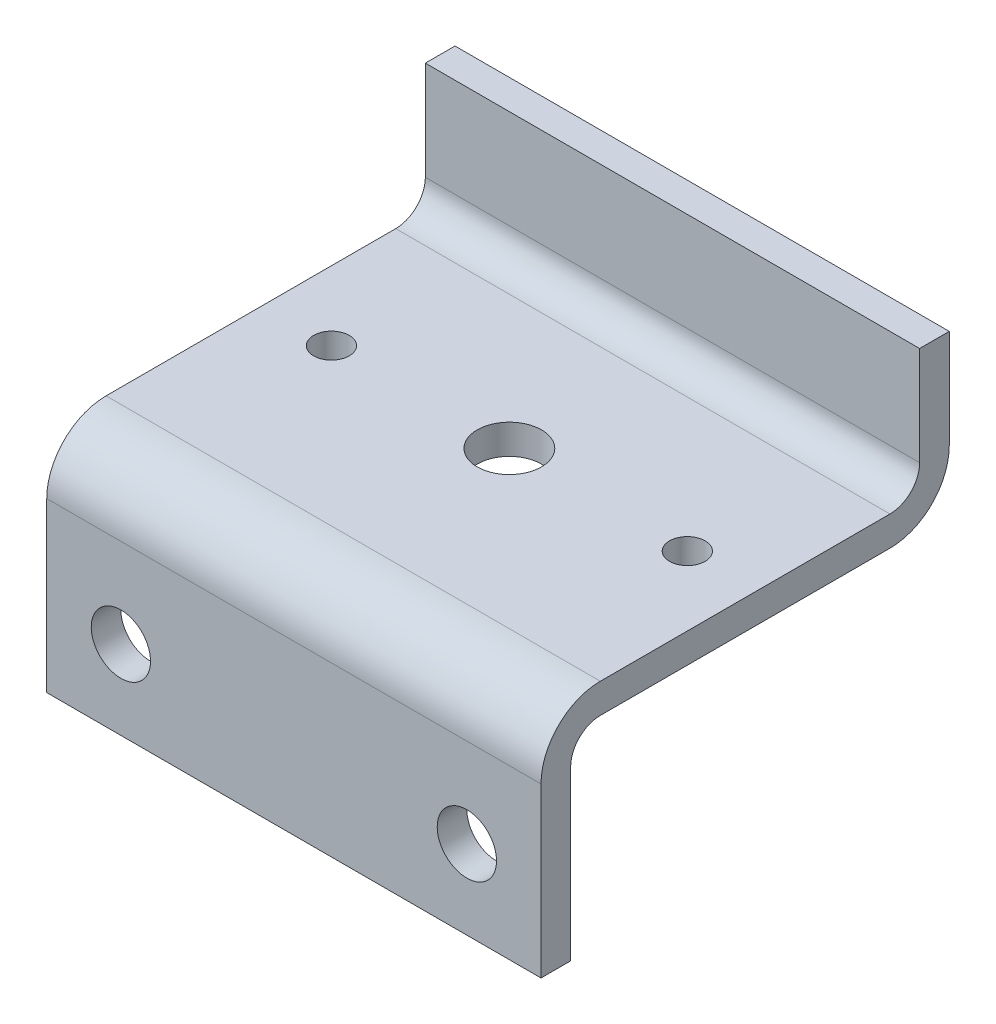
ISO-10303-21;
HEADER;
FILE_DESCRIPTION(('STEP AP214'),'2;1');
FILE_NAME('part.step','',(''),(''),'','','');
FILE_SCHEMA(('AUTOMOTIVE_DESIGN { 1 0 10303 214 1 1 1 1 }'));
ENDSEC;
DATA;
#1=APPLICATION_CONTEXT('core data for automotive mechanical design processes');
#2=APPLICATION_PROTOCOL_DEFINITION('international standard','automotive_design',2000,#1);
#3=PRODUCT_CONTEXT('',#1,'mechanical');
#4=PRODUCT('Part','Part','',(#3));
#5=PRODUCT_RELATED_PRODUCT_CATEGORY('part','',(#4));
#6=PRODUCT_DEFINITION_FORMATION('','',#4);
#7=PRODUCT_DEFINITION_CONTEXT('part definition',#1,'design');
#8=PRODUCT_DEFINITION('design','',#6,#7);
#9=PRODUCT_DEFINITION_SHAPE('','',#8);
#10=(LENGTH_UNIT() NAMED_UNIT(*) SI_UNIT(.MILLI.,.METRE.));
#11=(NAMED_UNIT(*) PLANE_ANGLE_UNIT() SI_UNIT($,.RADIAN.));
#12=(NAMED_UNIT(*) SI_UNIT($,.STERADIAN.) SOLID_ANGLE_UNIT());
#13=UNCERTAINTY_MEASURE_WITH_UNIT(LENGTH_MEASURE(1.E-05),#10,'distance_accuracy_value','');
#14=(GEOMETRIC_REPRESENTATION_CONTEXT(3) GLOBAL_UNCERTAINTY_ASSIGNED_CONTEXT((#13)) GLOBAL_UNIT_ASSIGNED_CONTEXT((#10,
#11,#12)) REPRESENTATION_CONTEXT('',''));
#15=CARTESIAN_POINT('',(0.,0.,0.));
#16=DIRECTION('',(0.,0.,1.));
#17=DIRECTION('',(1.,0.,0.));
#18=AXIS2_PLACEMENT_3D('',#15,#16,#17);
#19=CARTESIAN_POINT('',(25.,0.,-3.));
#20=DIRECTION('',(0.,1.,0.));
#21=DIRECTION('',(0.,0.,1.));
#22=AXIS2_PLACEMENT_3D('',#19,#20,#21);
#23=PLANE('',#22);
#24=DIRECTION('',(0.,0.,-1.));
#25=VECTOR('',#24,1.);
#26=CARTESIAN_POINT('',(-25.,0.,-3.));
#27=LINE('',#26,#25);
#28=CARTESIAN_POINT('',(-25.,0.,0.));
#29=VERTEX_POINT('',#28);
#30=CARTESIAN_POINT('',(-25.,0.,-3.));
#31=VERTEX_POINT('',#30);
#32=EDGE_CURVE('E159',#29,#31,#27,.T.);
#33=ORIENTED_EDGE('',*,*,#32,.T.);
#34=DIRECTION('',(-1.,0.,0.));
#35=VECTOR('',#34,1.);
#36=CARTESIAN_POINT('',(25.,0.,-3.));
#37=LINE('',#36,#35);
#38=CARTESIAN_POINT('',(25.,0.,-3.));
#39=VERTEX_POINT('',#38);
#40=EDGE_CURVE('E11',#39,#31,#37,.T.);
#41=ORIENTED_EDGE('',*,*,#40,.F.);
#42=DIRECTION('',(0.,0.,-1.));
#43=VECTOR('',#42,1.);
#44=CARTESIAN_POINT('',(25.,0.,-3.));
#45=LINE('',#44,#43);
#46=CARTESIAN_POINT('',(25.,0.,0.));
#47=VERTEX_POINT('',#46);
#48=EDGE_CURVE('E182',#47,#39,#45,.T.);
#49=ORIENTED_EDGE('',*,*,#48,.F.);
#50=DIRECTION('',(-1.,0.,0.));
#51=VECTOR('',#50,1.);
#52=CARTESIAN_POINT('',(25.,0.,0.));
#53=LINE('',#52,#51);
#54=EDGE_CURVE('E155',#47,#29,#53,.T.);
#55=ORIENTED_EDGE('',*,*,#54,.T.);
#56=EDGE_LOOP('',(#33,#41,#49,#55));
#57=FACE_BOUND('',#56,.T.);
#58=ADVANCED_FACE('F39',(#57),#23,.F.);
#59=CARTESIAN_POINT('',(25.,17.,-3.));
#60=DIRECTION('',(0.,0.,1.));
#61=DIRECTION('',(0.,-1.,0.));
#62=AXIS2_PLACEMENT_3D('',#59,#60,#61);
#63=PLANE('',#62);
#64=CARTESIAN_POINT('',(-17.5,7.99999999999998,-3.));
#65=DIRECTION('',(0.,0.,-1.));
#66=DIRECTION('',(0.,1.,0.));
#67=AXIS2_PLACEMENT_3D('',#64,#65,#66);
#68=CIRCLE('',#67,3.);
#69=CARTESIAN_POINT('',(-17.5,11.,-3.));
#70=VERTEX_POINT('',#69);
#71=EDGE_CURVE('E329',#70,#70,#68,.T.);
#72=ORIENTED_EDGE('',*,*,#71,.F.);
#73=EDGE_LOOP('',(#72));
#74=FACE_BOUND('',#73,.T.);
#75=CARTESIAN_POINT('',(17.5,7.99999999999998,-3.));
#76=DIRECTION('',(0.,0.,-1.));
#77=DIRECTION('',(0.,1.,0.));
#78=AXIS2_PLACEMENT_3D('',#75,#76,#77);
#79=CIRCLE('',#78,3.);
#80=CARTESIAN_POINT('',(17.5,11.,-3.));
#81=VERTEX_POINT('',#80);
#82=EDGE_CURVE('E326',#81,#81,#79,.T.);
#83=ORIENTED_EDGE('',*,*,#82,.F.);
#84=EDGE_LOOP('',(#83));
#85=FACE_BOUND('',#84,.T.);
#86=DIRECTION('',(0.,1.,0.));
#87=VECTOR('',#86,1.);
#88=CARTESIAN_POINT('',(-25.,17.,-3.));
#89=LINE('',#88,#87);
#90=CARTESIAN_POINT('',(-25.,17.,-3.));
#91=VERTEX_POINT('',#90);
#92=EDGE_CURVE('E162',#31,#91,#89,.T.);
#93=ORIENTED_EDGE('',*,*,#92,.T.);
#94=DIRECTION('',(-1.,0.,0.));
#95=VECTOR('',#94,1.);
#96=CARTESIAN_POINT('',(25.,17.,-3.));
#97=LINE('',#96,#95);
#98=CARTESIAN_POINT('',(25.,17.,-3.));
#99=VERTEX_POINT('',#98);
#100=EDGE_CURVE('E47',#99,#91,#97,.T.);
#101=ORIENTED_EDGE('',*,*,#100,.F.);
#102=DIRECTION('',(0.,1.,0.));
#103=VECTOR('',#102,1.);
#104=CARTESIAN_POINT('',(25.,17.,-3.));
#105=LINE('',#104,#103);
#106=EDGE_CURVE('E110',#39,#99,#105,.T.);
#107=ORIENTED_EDGE('',*,*,#106,.F.);
#108=ORIENTED_EDGE('',*,*,#40,.T.);
#109=EDGE_LOOP('',(#93,#101,#107,#108));
#110=FACE_BOUND('',#109,.T.);
#111=ADVANCED_FACE('F265',(#74,#85,#110),#63,.F.);
#112=CARTESIAN_POINT('',(25.,17.,-6.));
#113=DIRECTION('',(-1.,0.,0.));
#114=DIRECTION('',(0.,0.,1.));
#115=AXIS2_PLACEMENT_3D('',#112,#113,#114);
#116=CYLINDRICAL_SURFACE('',#115,3.);
#117=CARTESIAN_POINT('',(-25.,17.,-6.));
#118=DIRECTION('',(-1.,0.,0.));
#119=DIRECTION('',(0.,0.,-1.));
#120=AXIS2_PLACEMENT_3D('',#117,#118,#119);
#121=CIRCLE('',#120,3.);
#122=CARTESIAN_POINT('',(-25.,20.,-6.));
#123=VERTEX_POINT('',#122);
#124=EDGE_CURVE('E165',#91,#123,#121,.T.);
#125=ORIENTED_EDGE('',*,*,#124,.T.);
#126=DIRECTION('',(-1.,0.,0.));
#127=VECTOR('',#126,1.);
#128=CARTESIAN_POINT('',(25.,20.,-6.));
#129=LINE('',#128,#127);
#130=CARTESIAN_POINT('',(25.,20.,-6.));
#131=VERTEX_POINT('',#130);
#132=EDGE_CURVE('E201',#131,#123,#129,.T.);
#133=ORIENTED_EDGE('',*,*,#132,.F.);
#134=CARTESIAN_POINT('',(25.,17.,-6.));
#135=DIRECTION('',(-1.,0.,0.));
#136=DIRECTION('',(0.,0.,-1.));
#137=AXIS2_PLACEMENT_3D('',#134,#135,#136);
#138=CIRCLE('',#137,3.);
#139=EDGE_CURVE('E209',#99,#131,#138,.T.);
#140=ORIENTED_EDGE('',*,*,#139,.F.);
#141=ORIENTED_EDGE('',*,*,#100,.T.);
#142=EDGE_LOOP('',(#125,#133,#140,#141));
#143=FACE_BOUND('',#142,.T.);
#144=ADVANCED_FACE('F207',(#143),#116,.F.);
#145=CARTESIAN_POINT('',(25.,20.,-6.));
#146=DIRECTION('',(0.,1.,0.));
#147=DIRECTION('',(0.,0.,1.));
#148=AXIS2_PLACEMENT_3D('',#145,#146,#147);
#149=PLANE('',#148);
#150=CARTESIAN_POINT('',(18.,20.,-21.8));
#151=DIRECTION('',(0.,1.,0.));
#152=DIRECTION('',(0.,0.,1.));
#153=AXIS2_PLACEMENT_3D('',#150,#151,#152);
#154=CIRCLE('',#153,1.8);
#155=CARTESIAN_POINT('',(18.,20.,-20.));
#156=VERTEX_POINT('',#155);
#157=EDGE_CURVE('E320',#156,#156,#154,.F.);
#158=ORIENTED_EDGE('',*,*,#157,.F.);
#159=EDGE_LOOP('',(#158));
#160=FACE_BOUND('',#159,.T.);
#161=CARTESIAN_POINT('',(-18.,20.,-21.8));
#162=DIRECTION('',(0.,1.,0.));
#163=DIRECTION('',(0.,0.,1.));
#164=AXIS2_PLACEMENT_3D('',#161,#162,#163);
#165=CIRCLE('',#164,1.8);
#166=CARTESIAN_POINT('',(-18.,20.,-20.));
#167=VERTEX_POINT('',#166);
#168=EDGE_CURVE('E314',#167,#167,#165,.F.);
#169=ORIENTED_EDGE('',*,*,#168,.F.);
#170=EDGE_LOOP('',(#169));
#171=FACE_BOUND('',#170,.T.);
#172=CARTESIAN_POINT('',(0.,20.,-21.8));
#173=DIRECTION('',(0.,1.,0.));
#174=DIRECTION('',(0.,0.,1.));
#175=AXIS2_PLACEMENT_3D('',#172,#173,#174);
#176=CIRCLE('',#175,3.25);
#177=CARTESIAN_POINT('',(0.,20.,-18.55));
#178=VERTEX_POINT('',#177);
#179=EDGE_CURVE('E163',#178,#178,#176,.F.);
#180=ORIENTED_EDGE('',*,*,#179,.F.);
#181=EDGE_LOOP('',(#180));
#182=FACE_BOUND('',#181,.T.);
#183=DIRECTION('',(0.,0.,-1.));
#184=VECTOR('',#183,1.);
#185=CARTESIAN_POINT('',(-25.,20.,-6.));
#186=LINE('',#185,#184);
#187=CARTESIAN_POINT('',(-25.,20.,-35.3));
#188=VERTEX_POINT('',#187);
#189=EDGE_CURVE('E167',#123,#188,#186,.T.);
#190=ORIENTED_EDGE('',*,*,#189,.T.);
#191=DIRECTION('',(-1.,0.,0.));
#192=VECTOR('',#191,1.);
#193=CARTESIAN_POINT('',(25.,20.,-35.3));
#194=LINE('',#193,#192);
#195=CARTESIAN_POINT('',(25.,20.,-35.3));
#196=VERTEX_POINT('',#195);
#197=EDGE_CURVE('E198',#196,#188,#194,.T.);
#198=ORIENTED_EDGE('',*,*,#197,.F.);
#199=DIRECTION('',(0.,0.,-1.));
#200=VECTOR('',#199,1.);
#201=CARTESIAN_POINT('',(25.,20.,-6.));
#202=LINE('',#201,#200);
#203=EDGE_CURVE('E227',#131,#196,#202,.T.);
#204=ORIENTED_EDGE('',*,*,#203,.F.);
#205=ORIENTED_EDGE('',*,*,#132,.T.);
#206=EDGE_LOOP('',(#190,#198,#204,#205));
#207=FACE_BOUND('',#206,.T.);
#208=ADVANCED_FACE('F218',(#160,#171,#182,#207),#149,.F.);
#209=CARTESIAN_POINT('',(25.,26.,-35.3));
#210=DIRECTION('',(-1.,0.,0.));
#211=DIRECTION('',(0.,0.,1.));
#212=AXIS2_PLACEMENT_3D('',#209,#210,#211);
#213=CYLINDRICAL_SURFACE('',#212,6.);
#214=CARTESIAN_POINT('',(-25.,26.,-35.3));
#215=DIRECTION('',(1.,0.,0.));
#216=DIRECTION('',(0.,0.,1.));
#217=AXIS2_PLACEMENT_3D('',#214,#215,#216);
#218=CIRCLE('',#217,6.);
#219=CARTESIAN_POINT('',(-25.,26.,-41.3));
#220=VERTEX_POINT('',#219);
#221=EDGE_CURVE('E169',#188,#220,#218,.T.);
#222=ORIENTED_EDGE('',*,*,#221,.T.);
#223=DIRECTION('',(-1.,0.,0.));
#224=VECTOR('',#223,1.);
#225=CARTESIAN_POINT('',(25.,26.,-41.3));
#226=LINE('',#225,#224);
#227=CARTESIAN_POINT('',(25.,26.,-41.3));
#228=VERTEX_POINT('',#227);
#229=EDGE_CURVE('E195',#228,#220,#226,.T.);
#230=ORIENTED_EDGE('',*,*,#229,.F.);
#231=CARTESIAN_POINT('',(25.,26.,-35.3));
#232=DIRECTION('',(1.,0.,0.));
#233=DIRECTION('',(0.,0.,1.));
#234=AXIS2_PLACEMENT_3D('',#231,#232,#233);
#235=CIRCLE('',#234,6.);
#236=EDGE_CURVE('E224',#196,#228,#235,.T.);
#237=ORIENTED_EDGE('',*,*,#236,.F.);
#238=ORIENTED_EDGE('',*,*,#197,.T.);
#239=EDGE_LOOP('',(#222,#230,#237,#238));
#240=FACE_BOUND('',#239,.T.);
#241=ADVANCED_FACE('F222',(#240),#213,.T.);
#242=CARTESIAN_POINT('',(25.,36.,-41.3));
#243=DIRECTION('',(0.,0.,1.));
#244=DIRECTION('',(1.,0.,0.));
#245=AXIS2_PLACEMENT_3D('',#242,#243,#244);
#246=PLANE('',#245);
#247=DIRECTION('',(0.,1.,0.));
#248=VECTOR('',#247,1.);
#249=CARTESIAN_POINT('',(-25.,36.,-41.3));
#250=LINE('',#249,#248);
#251=CARTESIAN_POINT('',(-25.,36.,-41.3));
#252=VERTEX_POINT('',#251);
#253=EDGE_CURVE('E171',#220,#252,#250,.T.);
#254=ORIENTED_EDGE('',*,*,#253,.T.);
#255=DIRECTION('',(-1.,0.,0.));
#256=VECTOR('',#255,1.);
#257=CARTESIAN_POINT('',(25.,36.,-41.3));
#258=LINE('',#257,#256);
#259=CARTESIAN_POINT('',(25.,36.,-41.3));
#260=VERTEX_POINT('',#259);
#261=EDGE_CURVE('E192',#260,#252,#258,.T.);
#262=ORIENTED_EDGE('',*,*,#261,.F.);
#263=DIRECTION('',(0.,1.,0.));
#264=VECTOR('',#263,1.);
#265=CARTESIAN_POINT('',(25.,36.,-41.3));
#266=LINE('',#265,#264);
#267=EDGE_CURVE('E226',#228,#260,#266,.T.);
#268=ORIENTED_EDGE('',*,*,#267,.F.);
#269=ORIENTED_EDGE('',*,*,#229,.T.);
#270=EDGE_LOOP('',(#254,#262,#268,#269));
#271=FACE_BOUND('',#270,.T.);
#272=ADVANCED_FACE('F282',(#271),#246,.F.);
#273=CARTESIAN_POINT('',(25.,36.,-38.3));
#274=DIRECTION('',(0.,-1.,0.));
#275=DIRECTION('',(0.,0.,-1.));
#276=AXIS2_PLACEMENT_3D('',#273,#274,#275);
#277=PLANE('',#276);
#278=DIRECTION('',(0.,0.,1.));
#279=VECTOR('',#278,1.);
#280=CARTESIAN_POINT('',(-25.,36.,-38.3));
#281=LINE('',#280,#279);
#282=CARTESIAN_POINT('',(-25.,36.,-38.3));
#283=VERTEX_POINT('',#282);
#284=EDGE_CURVE('E173',#252,#283,#281,.T.);
#285=ORIENTED_EDGE('',*,*,#284,.T.);
#286=DIRECTION('',(-1.,0.,0.));
#287=VECTOR('',#286,1.);
#288=CARTESIAN_POINT('',(25.,36.,-38.3));
#289=LINE('',#288,#287);
#290=CARTESIAN_POINT('',(25.,36.,-38.3));
#291=VERTEX_POINT('',#290);
#292=EDGE_CURVE('E189',#291,#283,#289,.T.);
#293=ORIENTED_EDGE('',*,*,#292,.F.);
#294=DIRECTION('',(0.,0.,1.));
#295=VECTOR('',#294,1.);
#296=CARTESIAN_POINT('',(25.,36.,-38.3));
#297=LINE('',#296,#295);
#298=EDGE_CURVE('E229',#260,#291,#297,.T.);
#299=ORIENTED_EDGE('',*,*,#298,.F.);
#300=ORIENTED_EDGE('',*,*,#261,.T.);
#301=EDGE_LOOP('',(#285,#293,#299,#300));
#302=FACE_BOUND('',#301,.T.);
#303=ADVANCED_FACE('F285',(#302),#277,.F.);
#304=CARTESIAN_POINT('',(25.,26.,-38.3));
#305=DIRECTION('',(0.,0.,-1.));
#306=DIRECTION('',(-1.,0.,0.));
#307=AXIS2_PLACEMENT_3D('',#304,#305,#306);
#308=PLANE('',#307);
#309=DIRECTION('',(0.,-1.,0.));
#310=VECTOR('',#309,1.);
#311=CARTESIAN_POINT('',(-25.,26.,-38.3));
#312=LINE('',#311,#310);
#313=CARTESIAN_POINT('',(-25.,26.,-38.3));
#314=VERTEX_POINT('',#313);
#315=EDGE_CURVE('E175',#283,#314,#312,.T.);
#316=ORIENTED_EDGE('',*,*,#315,.T.);
#317=DIRECTION('',(-1.,0.,0.));
#318=VECTOR('',#317,1.);
#319=CARTESIAN_POINT('',(25.,26.,-38.3));
#320=LINE('',#319,#318);
#321=CARTESIAN_POINT('',(25.,26.,-38.3));
#322=VERTEX_POINT('',#321);
#323=EDGE_CURVE('E186',#322,#314,#320,.T.);
#324=ORIENTED_EDGE('',*,*,#323,.F.);
#325=DIRECTION('',(0.,-1.,0.));
#326=VECTOR('',#325,1.);
#327=CARTESIAN_POINT('',(25.,26.,-38.3));
#328=LINE('',#327,#326);
#329=EDGE_CURVE('E235',#291,#322,#328,.T.);
#330=ORIENTED_EDGE('',*,*,#329,.F.);
#331=ORIENTED_EDGE('',*,*,#292,.T.);
#332=EDGE_LOOP('',(#316,#324,#330,#331));
#333=FACE_BOUND('',#332,.T.);
#334=ADVANCED_FACE('F241',(#333),#308,.F.);
#335=CARTESIAN_POINT('',(25.,26.,-35.3));
#336=DIRECTION('',(-1.,0.,0.));
#337=DIRECTION('',(0.,0.,1.));
#338=AXIS2_PLACEMENT_3D('',#335,#336,#337);
#339=CYLINDRICAL_SURFACE('',#338,3.);
#340=CARTESIAN_POINT('',(-25.,26.,-35.3));
#341=DIRECTION('',(-1.,0.,0.));
#342=DIRECTION('',(0.,0.,-1.));
#343=AXIS2_PLACEMENT_3D('',#340,#341,#342);
#344=CIRCLE('',#343,3.);
#345=CARTESIAN_POINT('',(-25.,23.,-35.3));
#346=VERTEX_POINT('',#345);
#347=EDGE_CURVE('E177',#314,#346,#344,.T.);
#348=ORIENTED_EDGE('',*,*,#347,.T.);
#349=DIRECTION('',(-1.,0.,0.));
#350=VECTOR('',#349,1.);
#351=CARTESIAN_POINT('',(25.,23.,-35.3));
#352=LINE('',#351,#350);
#353=CARTESIAN_POINT('',(25.,23.,-35.3));
#354=VERTEX_POINT('',#353);
#355=EDGE_CURVE('E150',#354,#346,#352,.T.);
#356=ORIENTED_EDGE('',*,*,#355,.F.);
#357=CARTESIAN_POINT('',(25.,26.,-35.3));
#358=DIRECTION('',(-1.,0.,0.));
#359=DIRECTION('',(0.,0.,-1.));
#360=AXIS2_PLACEMENT_3D('',#357,#358,#359);
#361=CIRCLE('',#360,3.);
#362=EDGE_CURVE('E141',#322,#354,#361,.T.);
#363=ORIENTED_EDGE('',*,*,#362,.F.);
#364=ORIENTED_EDGE('',*,*,#323,.T.);
#365=EDGE_LOOP('',(#348,#356,#363,#364));
#366=FACE_BOUND('',#365,.T.);
#367=ADVANCED_FACE('F245',(#366),#339,.F.);
#368=CARTESIAN_POINT('',(25.,23.,-6.));
#369=DIRECTION('',(0.,-1.,0.));
#370=DIRECTION('',(0.,0.,-1.));
#371=AXIS2_PLACEMENT_3D('',#368,#369,#370);
#372=PLANE('',#371);
#373=CARTESIAN_POINT('',(18.,23.,-21.8));
#374=DIRECTION('',(0.,1.,0.));
#375=DIRECTION('',(0.,0.,1.));
#376=AXIS2_PLACEMENT_3D('',#373,#374,#375);
#377=CIRCLE('',#376,1.8);
#378=CARTESIAN_POINT('',(18.,23.,-20.));
#379=VERTEX_POINT('',#378);
#380=EDGE_CURVE('E302',#379,#379,#377,.T.);
#381=ORIENTED_EDGE('',*,*,#380,.F.);
#382=EDGE_LOOP('',(#381));
#383=FACE_BOUND('',#382,.T.);
#384=CARTESIAN_POINT('',(-18.,23.,-21.8));
#385=DIRECTION('',(0.,1.,0.));
#386=DIRECTION('',(0.,0.,1.));
#387=AXIS2_PLACEMENT_3D('',#384,#385,#386);
#388=CIRCLE('',#387,1.8);
#389=CARTESIAN_POINT('',(-18.,23.,-20.));
#390=VERTEX_POINT('',#389);
#391=EDGE_CURVE('E306',#390,#390,#388,.T.);
#392=ORIENTED_EDGE('',*,*,#391,.F.);
#393=EDGE_LOOP('',(#392));
#394=FACE_BOUND('',#393,.T.);
#395=CARTESIAN_POINT('',(0.,23.,-21.8));
#396=DIRECTION('',(0.,1.,0.));
#397=DIRECTION('',(0.,0.,1.));
#398=AXIS2_PLACEMENT_3D('',#395,#396,#397);
#399=CIRCLE('',#398,3.25);
#400=CARTESIAN_POINT('',(0.,23.,-18.55));
#401=VERTEX_POINT('',#400);
#402=EDGE_CURVE('E309',#401,#401,#399,.T.);
#403=ORIENTED_EDGE('',*,*,#402,.F.);
#404=EDGE_LOOP('',(#403));
#405=FACE_BOUND('',#404,.T.);
#406=DIRECTION('',(0.,0.,1.));
#407=VECTOR('',#406,1.);
#408=CARTESIAN_POINT('',(-25.,23.,-6.));
#409=LINE('',#408,#407);
#410=CARTESIAN_POINT('',(-25.,23.,-6.));
#411=VERTEX_POINT('',#410);
#412=EDGE_CURVE('E149',#346,#411,#409,.T.);
#413=ORIENTED_EDGE('',*,*,#412,.T.);
#414=DIRECTION('',(-1.,0.,0.));
#415=VECTOR('',#414,1.);
#416=CARTESIAN_POINT('',(25.,23.,-6.));
#417=LINE('',#416,#415);
#418=CARTESIAN_POINT('',(25.,23.,-6.));
#419=VERTEX_POINT('',#418);
#420=EDGE_CURVE('E146',#419,#411,#417,.T.);
#421=ORIENTED_EDGE('',*,*,#420,.F.);
#422=DIRECTION('',(0.,0.,1.));
#423=VECTOR('',#422,1.);
#424=CARTESIAN_POINT('',(25.,23.,-6.));
#425=LINE('',#424,#423);
#426=EDGE_CURVE('E135',#354,#419,#425,.T.);
#427=ORIENTED_EDGE('',*,*,#426,.F.);
#428=ORIENTED_EDGE('',*,*,#355,.T.);
#429=EDGE_LOOP('',(#413,#421,#427,#428));
#430=FACE_BOUND('',#429,.T.);
#431=ADVANCED_FACE('F147',(#383,#394,#405,#430),#372,.F.);
#432=CARTESIAN_POINT('',(25.,17.,-6.));
#433=DIRECTION('',(-1.,0.,0.));
#434=DIRECTION('',(0.,0.,1.));
#435=AXIS2_PLACEMENT_3D('',#432,#433,#434);
#436=CYLINDRICAL_SURFACE('',#435,6.);
#437=CARTESIAN_POINT('',(-25.,17.,-6.));
#438=DIRECTION('',(1.,0.,0.));
#439=DIRECTION('',(0.,0.,1.));
#440=AXIS2_PLACEMENT_3D('',#437,#438,#439);
#441=CIRCLE('',#440,6.);
#442=CARTESIAN_POINT('',(-25.,17.,0.));
#443=VERTEX_POINT('',#442);
#444=EDGE_CURVE('E96',#411,#443,#441,.T.);
#445=ORIENTED_EDGE('',*,*,#444,.T.);
#446=DIRECTION('',(-1.,0.,0.));
#447=VECTOR('',#446,1.);
#448=CARTESIAN_POINT('',(25.,17.,0.));
#449=LINE('',#448,#447);
#450=CARTESIAN_POINT('',(25.,17.,0.));
#451=VERTEX_POINT('',#450);
#452=EDGE_CURVE('E151',#451,#443,#449,.T.);
#453=ORIENTED_EDGE('',*,*,#452,.F.);
#454=CARTESIAN_POINT('',(25.,17.,-6.));
#455=DIRECTION('',(1.,0.,0.));
#456=DIRECTION('',(0.,0.,1.));
#457=AXIS2_PLACEMENT_3D('',#454,#455,#456);
#458=CIRCLE('',#457,6.);
#459=EDGE_CURVE('E139',#419,#451,#458,.T.);
#460=ORIENTED_EDGE('',*,*,#459,.F.);
#461=ORIENTED_EDGE('',*,*,#420,.T.);
#462=EDGE_LOOP('',(#445,#453,#460,#461));
#463=FACE_BOUND('',#462,.T.);
#464=ADVANCED_FACE('F153',(#463),#436,.T.);
#465=CARTESIAN_POINT('',(25.,0.,0.));
#466=DIRECTION('',(0.,0.,-1.));
#467=DIRECTION('',(-1.,0.,0.));
#468=AXIS2_PLACEMENT_3D('',#465,#466,#467);
#469=PLANE('',#468);
#470=CARTESIAN_POINT('',(-17.5,7.99999999999998,0.));
#471=DIRECTION('',(0.,0.,-1.));
#472=DIRECTION('',(-1.,0.,0.));
#473=AXIS2_PLACEMENT_3D('',#470,#471,#472);
#474=CIRCLE('',#473,3.);
#475=CARTESIAN_POINT('',(-17.5,11.,0.));
#476=VERTEX_POINT('',#475);
#477=EDGE_CURVE('E322',#476,#476,#474,.F.);
#478=ORIENTED_EDGE('',*,*,#477,.F.);
#479=EDGE_LOOP('',(#478));
#480=FACE_BOUND('',#479,.T.);
#481=CARTESIAN_POINT('',(17.5,7.99999999999998,0.));
#482=DIRECTION('',(0.,0.,-1.));
#483=DIRECTION('',(-1.,0.,0.));
#484=AXIS2_PLACEMENT_3D('',#481,#482,#483);
#485=CIRCLE('',#484,3.);
#486=CARTESIAN_POINT('',(17.5,11.,0.));
#487=VERTEX_POINT('',#486);
#488=EDGE_CURVE('E330',#487,#487,#485,.F.);
#489=ORIENTED_EDGE('',*,*,#488,.F.);
#490=EDGE_LOOP('',(#489));
#491=FACE_BOUND('',#490,.T.);
#492=DIRECTION('',(0.,-1.,0.));
#493=VECTOR('',#492,1.);
#494=CARTESIAN_POINT('',(-25.,0.,0.));
#495=LINE('',#494,#493);
#496=EDGE_CURVE('E102',#443,#29,#495,.T.);
#497=ORIENTED_EDGE('',*,*,#496,.T.);
#498=ORIENTED_EDGE('',*,*,#54,.F.);
#499=DIRECTION('',(0.,-1.,0.));
#500=VECTOR('',#499,1.);
#501=CARTESIAN_POINT('',(25.,0.,0.));
#502=LINE('',#501,#500);
#503=EDGE_CURVE('E55',#451,#47,#502,.T.);
#504=ORIENTED_EDGE('',*,*,#503,.F.);
#505=ORIENTED_EDGE('',*,*,#452,.T.);
#506=EDGE_LOOP('',(#497,#498,#504,#505));
#507=FACE_BOUND('',#506,.T.);
#508=ADVANCED_FACE('F249',(#480,#491,#507),#469,.F.);
#509=CARTESIAN_POINT('',(25.,17.,-6.));
#510=DIRECTION('',(-1.,0.,0.));
#511=DIRECTION('',(0.,0.,1.));
#512=AXIS2_PLACEMENT_3D('',#509,#510,#511);
#513=PLANE('',#512);
#514=ORIENTED_EDGE('',*,*,#48,.T.);
#515=ORIENTED_EDGE('',*,*,#106,.T.);
#516=ORIENTED_EDGE('',*,*,#139,.T.);
#517=ORIENTED_EDGE('',*,*,#203,.T.);
#518=ORIENTED_EDGE('',*,*,#236,.T.);
#519=ORIENTED_EDGE('',*,*,#267,.T.);
#520=ORIENTED_EDGE('',*,*,#298,.T.);
#521=ORIENTED_EDGE('',*,*,#329,.T.);
#522=ORIENTED_EDGE('',*,*,#362,.T.);
#523=ORIENTED_EDGE('',*,*,#426,.T.);
#524=ORIENTED_EDGE('',*,*,#459,.T.);
#525=ORIENTED_EDGE('',*,*,#503,.T.);
#526=EDGE_LOOP('',(#514,#515,#516,#517,#518,#519,#520,#521,#522,#523,#524,#525));
#527=FACE_BOUND('',#526,.T.);
#528=ADVANCED_FACE('F137',(#527),#513,.F.);
#529=CARTESIAN_POINT('',(-25.,17.,-6.));
#530=DIRECTION('',(-1.,0.,0.));
#531=DIRECTION('',(0.,0.,1.));
#532=AXIS2_PLACEMENT_3D('',#529,#530,#531);
#533=PLANE('',#532);
#534=ORIENTED_EDGE('',*,*,#32,.F.);
#535=ORIENTED_EDGE('',*,*,#496,.F.);
#536=ORIENTED_EDGE('',*,*,#444,.F.);
#537=ORIENTED_EDGE('',*,*,#412,.F.);
#538=ORIENTED_EDGE('',*,*,#347,.F.);
#539=ORIENTED_EDGE('',*,*,#315,.F.);
#540=ORIENTED_EDGE('',*,*,#284,.F.);
#541=ORIENTED_EDGE('',*,*,#253,.F.);
#542=ORIENTED_EDGE('',*,*,#221,.F.);
#543=ORIENTED_EDGE('',*,*,#189,.F.);
#544=ORIENTED_EDGE('',*,*,#124,.F.);
#545=ORIENTED_EDGE('',*,*,#92,.F.);
#546=EDGE_LOOP('',(#534,#535,#536,#537,#538,#539,#540,#541,#542,#543,#544,#545));
#547=FACE_BOUND('',#546,.T.);
#548=ADVANCED_FACE('F213',(#547),#533,.T.);
#549=CARTESIAN_POINT('',(0.,-0.001000000000001,-21.8));
#550=DIRECTION('',(0.,1.,0.));
#551=DIRECTION('',(0.,0.,1.));
#552=AXIS2_PLACEMENT_3D('',#549,#550,#551);
#553=CYLINDRICAL_SURFACE('',#552,3.25);
#554=ORIENTED_EDGE('',*,*,#402,.T.);
#555=EDGE_LOOP('',(#554));
#556=FACE_BOUND('',#555,.T.);
#557=ORIENTED_EDGE('',*,*,#179,.T.);
#558=EDGE_LOOP('',(#557));
#559=FACE_BOUND('',#558,.T.);
#560=ADVANCED_FACE('F351',(#556,#559),#553,.F.);
#561=CARTESIAN_POINT('',(-18.,-0.001000000000001,-21.8));
#562=DIRECTION('',(0.,1.,0.));
#563=DIRECTION('',(0.,0.,1.));
#564=AXIS2_PLACEMENT_3D('',#561,#562,#563);
#565=CYLINDRICAL_SURFACE('',#564,1.8);
#566=ORIENTED_EDGE('',*,*,#391,.T.);
#567=EDGE_LOOP('',(#566));
#568=FACE_BOUND('',#567,.T.);
#569=ORIENTED_EDGE('',*,*,#168,.T.);
#570=EDGE_LOOP('',(#569));
#571=FACE_BOUND('',#570,.T.);
#572=ADVANCED_FACE('F348',(#568,#571),#565,.F.);
#573=CARTESIAN_POINT('',(18.,-0.001000000000001,-21.8));
#574=DIRECTION('',(0.,1.,0.));
#575=DIRECTION('',(0.,0.,1.));
#576=AXIS2_PLACEMENT_3D('',#573,#574,#575);
#577=CYLINDRICAL_SURFACE('',#576,1.8);
#578=ORIENTED_EDGE('',*,*,#380,.T.);
#579=EDGE_LOOP('',(#578));
#580=FACE_BOUND('',#579,.T.);
#581=ORIENTED_EDGE('',*,*,#157,.T.);
#582=EDGE_LOOP('',(#581));
#583=FACE_BOUND('',#582,.T.);
#584=ADVANCED_FACE('F344',(#580,#583),#577,.F.);
#585=CARTESIAN_POINT('',(17.5,7.99999999999998,0.0010000000000023));
#586=DIRECTION('',(0.,0.,-1.));
#587=DIRECTION('',(0.,1.,0.));
#588=AXIS2_PLACEMENT_3D('',#585,#586,#587);
#589=CYLINDRICAL_SURFACE('',#588,3.);
#590=CARTESIAN_POINT('',(17.5,11.,-3.));
#591=CARTESIAN_POINT('',(17.5,11.,-2.96875));
#592=CARTESIAN_POINT('',(17.5,11.,-2.9375));
#593=CARTESIAN_POINT('',(17.5,11.,-2.875));
#594=CARTESIAN_POINT('',(17.5,11.,-2.84375));
#595=CARTESIAN_POINT('',(17.5,11.,-2.78125));
#596=CARTESIAN_POINT('',(17.5,11.,-2.75));
#597=CARTESIAN_POINT('',(17.5,11.,-2.6875));
#598=CARTESIAN_POINT('',(17.5,11.,-2.65625));
#599=CARTESIAN_POINT('',(17.5,11.,-2.59375));
#600=CARTESIAN_POINT('',(17.5,11.,-2.5625));
#601=CARTESIAN_POINT('',(17.5,11.,-2.5));
#602=CARTESIAN_POINT('',(17.5,11.,-2.46875));
#603=CARTESIAN_POINT('',(17.5,11.,-2.40625));
#604=CARTESIAN_POINT('',(17.5,11.,-2.375));
#605=CARTESIAN_POINT('',(17.5,11.,-2.3125));
#606=CARTESIAN_POINT('',(17.5,11.,-2.28125));
#607=CARTESIAN_POINT('',(17.5,11.,-2.21875));
#608=CARTESIAN_POINT('',(17.5,11.,-2.1875));
#609=CARTESIAN_POINT('',(17.5,11.,-2.125));
#610=CARTESIAN_POINT('',(17.5,11.,-2.09375));
#611=CARTESIAN_POINT('',(17.5,11.,-2.03125));
#612=CARTESIAN_POINT('',(17.5,11.,-2.));
#613=CARTESIAN_POINT('',(17.5,11.,-1.9375));
#614=CARTESIAN_POINT('',(17.5,11.,-1.90625));
#615=CARTESIAN_POINT('',(17.5,11.,-1.84375));
#616=CARTESIAN_POINT('',(17.5,11.,-1.8125));
#617=CARTESIAN_POINT('',(17.5,11.,-1.75));
#618=CARTESIAN_POINT('',(17.5,11.,-1.71875));
#619=CARTESIAN_POINT('',(17.5,11.,-1.65625));
#620=CARTESIAN_POINT('',(17.5,11.,-1.625));
#621=CARTESIAN_POINT('',(17.5,11.,-1.5625));
#622=CARTESIAN_POINT('',(17.5,11.,-1.53125));
#623=CARTESIAN_POINT('',(17.5,11.,-1.46875));
#624=CARTESIAN_POINT('',(17.5,11.,-1.4375));
#625=CARTESIAN_POINT('',(17.5,11.,-1.375));
#626=CARTESIAN_POINT('',(17.5,11.,-1.34375));
#627=CARTESIAN_POINT('',(17.5,11.,-1.28125));
#628=CARTESIAN_POINT('',(17.5,11.,-1.25));
#629=CARTESIAN_POINT('',(17.5,11.,-1.1875));
#630=CARTESIAN_POINT('',(17.5,11.,-1.15625));
#631=CARTESIAN_POINT('',(17.5,11.,-1.09375));
#632=CARTESIAN_POINT('',(17.5,11.,-1.0625));
#633=CARTESIAN_POINT('',(17.5,11.,-0.999999999999999));
#634=CARTESIAN_POINT('',(17.5,11.,-0.968749999999999));
#635=CARTESIAN_POINT('',(17.5,11.,-0.906249999999999));
#636=CARTESIAN_POINT('',(17.5,11.,-0.874999999999999));
#637=CARTESIAN_POINT('',(17.5,11.,-0.812499999999999));
#638=CARTESIAN_POINT('',(17.5,11.,-0.781249999999999));
#639=CARTESIAN_POINT('',(17.5,11.,-0.718749999999999));
#640=CARTESIAN_POINT('',(17.5,11.,-0.687499999999999));
#641=CARTESIAN_POINT('',(17.5,11.,-0.624999999999999));
#642=CARTESIAN_POINT('',(17.5,11.,-0.593749999999999));
#643=CARTESIAN_POINT('',(17.5,11.,-0.531249999999999));
#644=CARTESIAN_POINT('',(17.5,11.,-0.499999999999999));
#645=CARTESIAN_POINT('',(17.5,11.,-0.437499999999999));
#646=CARTESIAN_POINT('',(17.5,11.,-0.406249999999999));
#647=CARTESIAN_POINT('',(17.5,11.,-0.34375));
#648=CARTESIAN_POINT('',(17.5,11.,-0.3125));
#649=CARTESIAN_POINT('',(17.5,11.,-0.25));
#650=CARTESIAN_POINT('',(17.5,11.,-0.21875));
#651=CARTESIAN_POINT('',(17.5,11.,-0.15625));
#652=CARTESIAN_POINT('',(17.5,11.,-0.125));
#653=CARTESIAN_POINT('',(17.5,11.,-0.0625000000000001));
#654=CARTESIAN_POINT('',(17.5,11.,-0.03125));
#655=CARTESIAN_POINT('',(17.5,11.,0.));
#656=B_SPLINE_CURVE_WITH_KNOTS('',3,(#590,#591,#592,#593,#594,#595,#596,#597,#598,#599,#600,
#601,#602,#603,#604,#605,#606,#607,#608,#609,#610,#611,#612,#613,#614,#615,#616,#617,#618,#619,
#620,#621,#622,#623,#624,#625,#626,#627,#628,#629,#630,#631,#632,#633,#634,#635,#636,#637,#638,
#639,#640,#641,#642,#643,#644,#645,#646,#647,#648,#649,#650,#651,#652,#653,#654,#655),
.UNSPECIFIED.,.F.,.F.,(4,2,2,2,2,2,2,2,2,2,2,2,2,2,2,2,2,2,2,2,2,2,2,2,2,2,2,2,2,2,2,2,4),(0.,
0.0937500000000001,0.1875,0.28125,0.374999999999999,0.46875,0.5625,0.656249999999999,
0.749999999999999,0.843749999999999,0.937499999999999,1.03125,1.125,1.21875,1.3125,1.40625,1.5,
1.59375,1.6875,1.78125,1.875,1.96875,2.0625,2.15625,2.25,2.34375,2.4375,2.53125,2.625,2.71875,
2.8125,2.90625,3.),.UNSPECIFIED.);
#657=EDGE_CURVE('BSEAM340',#81,#487,#656,.T.);
#658=ORIENTED_EDGE('',*,*,#82,.T.);
#659=ORIENTED_EDGE('',*,*,#488,.T.);
#660=ORIENTED_EDGE('',*,*,#657,.T.);
#661=ORIENTED_EDGE('',*,*,#657,.F.);
#662=EDGE_LOOP('',(#658,#660,#659,#661));
#663=FACE_BOUND('',#662,.T.);
#664=ADVANCED_FACE('F340',(#663),#589,.F.);
#665=CARTESIAN_POINT('',(-17.5,7.99999999999998,0.0010000000000023));
#666=DIRECTION('',(0.,0.,-1.));
#667=DIRECTION('',(0.,1.,0.));
#668=AXIS2_PLACEMENT_3D('',#665,#666,#667);
#669=CYLINDRICAL_SURFACE('',#668,3.);
#670=CARTESIAN_POINT('',(-17.5,11.,-3.));
#671=CARTESIAN_POINT('',(-17.5,11.,-2.96875));
#672=CARTESIAN_POINT('',(-17.5,11.,-2.9375));
#673=CARTESIAN_POINT('',(-17.5,11.,-2.875));
#674=CARTESIAN_POINT('',(-17.5,11.,-2.84375));
#675=CARTESIAN_POINT('',(-17.5,11.,-2.78125));
#676=CARTESIAN_POINT('',(-17.5,11.,-2.75));
#677=CARTESIAN_POINT('',(-17.5,11.,-2.6875));
#678=CARTESIAN_POINT('',(-17.5,11.,-2.65625));
#679=CARTESIAN_POINT('',(-17.5,11.,-2.59375));
#680=CARTESIAN_POINT('',(-17.5,11.,-2.5625));
#681=CARTESIAN_POINT('',(-17.5,11.,-2.5));
#682=CARTESIAN_POINT('',(-17.5,11.,-2.46875));
#683=CARTESIAN_POINT('',(-17.5,11.,-2.40625));
#684=CARTESIAN_POINT('',(-17.5,11.,-2.375));
#685=CARTESIAN_POINT('',(-17.5,11.,-2.3125));
#686=CARTESIAN_POINT('',(-17.5,11.,-2.28125));
#687=CARTESIAN_POINT('',(-17.5,11.,-2.21875));
#688=CARTESIAN_POINT('',(-17.5,11.,-2.1875));
#689=CARTESIAN_POINT('',(-17.5,11.,-2.125));
#690=CARTESIAN_POINT('',(-17.5,11.,-2.09375));
#691=CARTESIAN_POINT('',(-17.5,11.,-2.03125));
#692=CARTESIAN_POINT('',(-17.5,11.,-2.));
#693=CARTESIAN_POINT('',(-17.5,11.,-1.9375));
#694=CARTESIAN_POINT('',(-17.5,11.,-1.90625));
#695=CARTESIAN_POINT('',(-17.5,11.,-1.84375));
#696=CARTESIAN_POINT('',(-17.5,11.,-1.8125));
#697=CARTESIAN_POINT('',(-17.5,11.,-1.75));
#698=CARTESIAN_POINT('',(-17.5,11.,-1.71875));
#699=CARTESIAN_POINT('',(-17.5,11.,-1.65625));
#700=CARTESIAN_POINT('',(-17.5,11.,-1.625));
#701=CARTESIAN_POINT('',(-17.5,11.,-1.5625));
#702=CARTESIAN_POINT('',(-17.5,11.,-1.53125));
#703=CARTESIAN_POINT('',(-17.5,11.,-1.46875));
#704=CARTESIAN_POINT('',(-17.5,11.,-1.4375));
#705=CARTESIAN_POINT('',(-17.5,11.,-1.375));
#706=CARTESIAN_POINT('',(-17.5,11.,-1.34375));
#707=CARTESIAN_POINT('',(-17.5,11.,-1.28125));
#708=CARTESIAN_POINT('',(-17.5,11.,-1.25));
#709=CARTESIAN_POINT('',(-17.5,11.,-1.1875));
#710=CARTESIAN_POINT('',(-17.5,11.,-1.15625));
#711=CARTESIAN_POINT('',(-17.5,11.,-1.09375));
#712=CARTESIAN_POINT('',(-17.5,11.,-1.0625));
#713=CARTESIAN_POINT('',(-17.5,11.,-0.999999999999999));
#714=CARTESIAN_POINT('',(-17.5,11.,-0.968749999999999));
#715=CARTESIAN_POINT('',(-17.5,11.,-0.906249999999999));
#716=CARTESIAN_POINT('',(-17.5,11.,-0.874999999999999));
#717=CARTESIAN_POINT('',(-17.5,11.,-0.812499999999999));
#718=CARTESIAN_POINT('',(-17.5,11.,-0.781249999999999));
#719=CARTESIAN_POINT('',(-17.5,11.,-0.718749999999999));
#720=CARTESIAN_POINT('',(-17.5,11.,-0.687499999999999));
#721=CARTESIAN_POINT('',(-17.5,11.,-0.624999999999999));
#722=CARTESIAN_POINT('',(-17.5,11.,-0.593749999999999));
#723=CARTESIAN_POINT('',(-17.5,11.,-0.531249999999999));
#724=CARTESIAN_POINT('',(-17.5,11.,-0.499999999999999));
#725=CARTESIAN_POINT('',(-17.5,11.,-0.437499999999999));
#726=CARTESIAN_POINT('',(-17.5,11.,-0.406249999999999));
#727=CARTESIAN_POINT('',(-17.5,11.,-0.34375));
#728=CARTESIAN_POINT('',(-17.5,11.,-0.3125));
#729=CARTESIAN_POINT('',(-17.5,11.,-0.25));
#730=CARTESIAN_POINT('',(-17.5,11.,-0.21875));
#731=CARTESIAN_POINT('',(-17.5,11.,-0.15625));
#732=CARTESIAN_POINT('',(-17.5,11.,-0.125));
#733=CARTESIAN_POINT('',(-17.5,11.,-0.0625000000000001));
#734=CARTESIAN_POINT('',(-17.5,11.,-0.03125));
#735=CARTESIAN_POINT('',(-17.5,11.,0.));
#736=B_SPLINE_CURVE_WITH_KNOTS('',3,(#670,#671,#672,#673,#674,#675,#676,#677,#678,#679,#680,
#681,#682,#683,#684,#685,#686,#687,#688,#689,#690,#691,#692,#693,#694,#695,#696,#697,#698,#699,
#700,#701,#702,#703,#704,#705,#706,#707,#708,#709,#710,#711,#712,#713,#714,#715,#716,#717,#718,
#719,#720,#721,#722,#723,#724,#725,#726,#727,#728,#729,#730,#731,#732,#733,#734,#735),
.UNSPECIFIED.,.F.,.F.,(4,2,2,2,2,2,2,2,2,2,2,2,2,2,2,2,2,2,2,2,2,2,2,2,2,2,2,2,2,2,2,2,4),(0.,
0.0937500000000001,0.1875,0.28125,0.374999999999999,0.46875,0.5625,0.656249999999999,
0.749999999999999,0.843749999999999,0.937499999999999,1.03125,1.125,1.21875,1.3125,1.40625,1.5,
1.59375,1.6875,1.78125,1.875,1.96875,2.0625,2.15625,2.25,2.34375,2.4375,2.53125,2.625,2.71875,
2.8125,2.90625,3.),.UNSPECIFIED.);
#737=EDGE_CURVE('BSEAM337',#70,#476,#736,.T.);
#738=ORIENTED_EDGE('',*,*,#71,.T.);
#739=ORIENTED_EDGE('',*,*,#477,.T.);
#740=ORIENTED_EDGE('',*,*,#737,.T.);
#741=ORIENTED_EDGE('',*,*,#737,.F.);
#742=EDGE_LOOP('',(#738,#740,#739,#741));
#743=FACE_BOUND('',#742,.T.);
#744=ADVANCED_FACE('F337',(#743),#669,.F.);
#745=CLOSED_SHELL('',(#58,#111,#144,#208,#241,#272,#303,#334,#367,#431,#464,#508,#528,#548,#560,
#572,#584,#664,#744));
#746=MANIFOLD_SOLID_BREP('B2',#745);
#747=ADVANCED_BREP_SHAPE_REPRESENTATION('',(#18,#746),#14);
#748=SHAPE_DEFINITION_REPRESENTATION(#9,#747);
ENDSEC;
END-ISO-10303-21;
